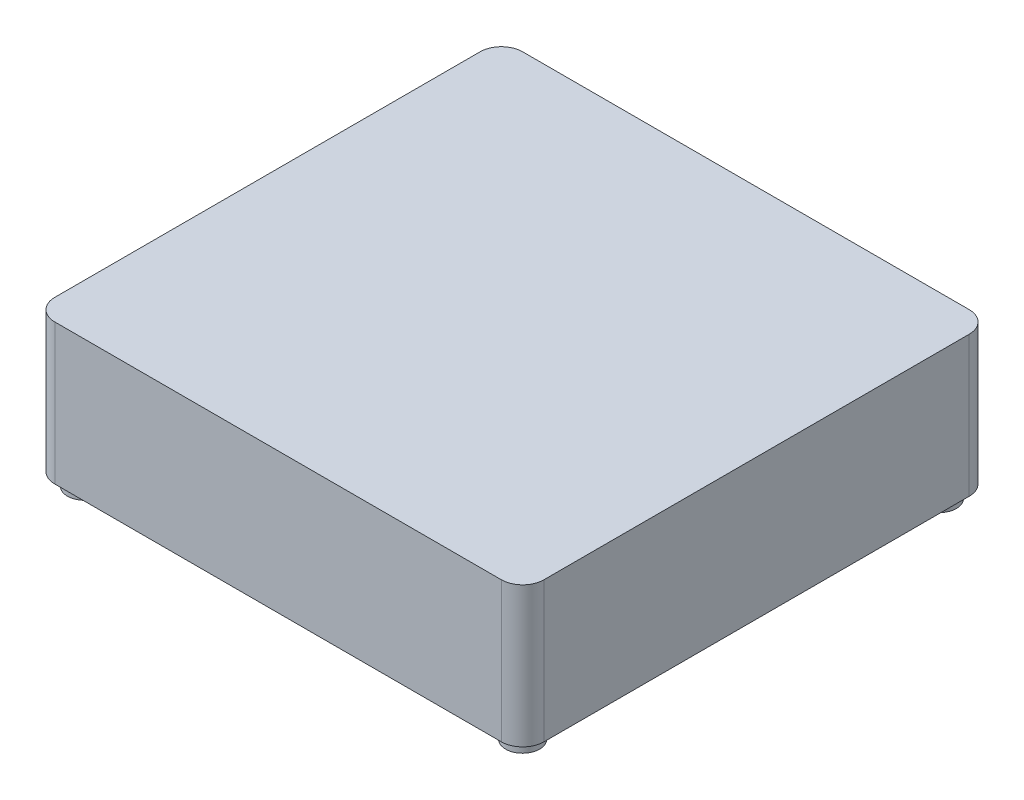
ISO-10303-21;
HEADER;
FILE_DESCRIPTION(('STEP AP214'),'2;1');
FILE_NAME('part.step','',(''),(''),'','','');
FILE_SCHEMA(('AUTOMOTIVE_DESIGN { 1 0 10303 214 1 1 1 1 }'));
ENDSEC;
DATA;
#1=APPLICATION_CONTEXT('core data for automotive mechanical design processes');
#2=APPLICATION_PROTOCOL_DEFINITION('international standard','automotive_design',2000,#1);
#3=PRODUCT_CONTEXT('',#1,'mechanical');
#4=PRODUCT('Part','Part','',(#3));
#5=PRODUCT_RELATED_PRODUCT_CATEGORY('part','',(#4));
#6=PRODUCT_DEFINITION_FORMATION('','',#4);
#7=PRODUCT_DEFINITION_CONTEXT('part definition',#1,'design');
#8=PRODUCT_DEFINITION('design','',#6,#7);
#9=PRODUCT_DEFINITION_SHAPE('','',#8);
#10=(LENGTH_UNIT() NAMED_UNIT(*) SI_UNIT(.MILLI.,.METRE.));
#11=(NAMED_UNIT(*) PLANE_ANGLE_UNIT() SI_UNIT($,.RADIAN.));
#12=(NAMED_UNIT(*) SI_UNIT($,.STERADIAN.) SOLID_ANGLE_UNIT());
#13=UNCERTAINTY_MEASURE_WITH_UNIT(LENGTH_MEASURE(1.E-05),#10,'distance_accuracy_value','');
#14=(GEOMETRIC_REPRESENTATION_CONTEXT(3) GLOBAL_UNCERTAINTY_ASSIGNED_CONTEXT((#13)) GLOBAL_UNIT_ASSIGNED_CONTEXT((#10,
#11,#12)) REPRESENTATION_CONTEXT('',''));
#15=CARTESIAN_POINT('',(0.,0.,0.));
#16=DIRECTION('',(0.,0.,1.));
#17=DIRECTION('',(1.,0.,0.));
#18=AXIS2_PLACEMENT_3D('',#15,#16,#17);
#19=CARTESIAN_POINT('',(-52.5,33.,-50.));
#20=DIRECTION('',(0.,-1.,0.));
#21=DIRECTION('',(0.,0.,-1.));
#22=AXIS2_PLACEMENT_3D('',#19,#20,#21);
#23=CYLINDRICAL_SURFACE('',#22,5.);
#24=CARTESIAN_POINT('',(-52.5,0.,-50.));
#25=DIRECTION('',(0.,1.,0.));
#26=DIRECTION('',(0.,0.,-1.));
#27=AXIS2_PLACEMENT_3D('',#24,#25,#26);
#28=CIRCLE('',#27,5.);
#29=CARTESIAN_POINT('',(-52.5,0.,-55.));
#30=VERTEX_POINT('',#29);
#31=CARTESIAN_POINT('',(-57.5,0.,-50.));
#32=VERTEX_POINT('',#31);
#33=EDGE_CURVE('E279',#30,#32,#28,.T.);
#34=ORIENTED_EDGE('',*,*,#33,.T.);
#35=DIRECTION('',(0.,-1.,0.));
#36=VECTOR('',#35,1.);
#37=CARTESIAN_POINT('',(-57.5,33.,-50.));
#38=LINE('',#37,#36);
#39=CARTESIAN_POINT('',(-57.5,33.,-50.));
#40=VERTEX_POINT('',#39);
#41=EDGE_CURVE('E11',#40,#32,#38,.T.);
#42=ORIENTED_EDGE('',*,*,#41,.F.);
#43=CARTESIAN_POINT('',(-52.5,33.,-50.));
#44=DIRECTION('',(0.,1.,0.));
#45=DIRECTION('',(0.,0.,-1.));
#46=AXIS2_PLACEMENT_3D('',#43,#44,#45);
#47=CIRCLE('',#46,5.);
#48=CARTESIAN_POINT('',(-52.5,33.,-55.));
#49=VERTEX_POINT('',#48);
#50=EDGE_CURVE('E283',#49,#40,#47,.T.);
#51=ORIENTED_EDGE('',*,*,#50,.F.);
#52=DIRECTION('',(0.,-1.,0.));
#53=VECTOR('',#52,1.);
#54=CARTESIAN_POINT('',(-52.5,33.,-55.));
#55=LINE('',#54,#53);
#56=EDGE_CURVE('E309',#49,#30,#55,.T.);
#57=ORIENTED_EDGE('',*,*,#56,.T.);
#58=EDGE_LOOP('',(#34,#42,#51,#57));
#59=FACE_BOUND('',#58,.T.);
#60=ADVANCED_FACE('F38',(#59),#23,.T.);
#61=CARTESIAN_POINT('',(-57.5,33.,-50.));
#62=DIRECTION('',(1.,0.,0.));
#63=DIRECTION('',(0.,0.,-1.));
#64=AXIS2_PLACEMENT_3D('',#61,#62,#63);
#65=PLANE('',#64);
#66=DIRECTION('',(0.,0.,1.));
#67=VECTOR('',#66,1.);
#68=CARTESIAN_POINT('',(-57.5,0.,-50.));
#69=LINE('',#68,#67);
#70=CARTESIAN_POINT('',(-57.5,0.,50.));
#71=VERTEX_POINT('',#70);
#72=EDGE_CURVE('E313',#32,#71,#69,.T.);
#73=ORIENTED_EDGE('',*,*,#72,.T.);
#74=DIRECTION('',(0.,-1.,0.));
#75=VECTOR('',#74,1.);
#76=CARTESIAN_POINT('',(-57.5,33.,50.));
#77=LINE('',#76,#75);
#78=CARTESIAN_POINT('',(-57.5,33.,50.));
#79=VERTEX_POINT('',#78);
#80=EDGE_CURVE('E46',#79,#71,#77,.T.);
#81=ORIENTED_EDGE('',*,*,#80,.F.);
#82=DIRECTION('',(0.,0.,1.));
#83=VECTOR('',#82,1.);
#84=CARTESIAN_POINT('',(-57.5,33.,-50.));
#85=LINE('',#84,#83);
#86=EDGE_CURVE('E287',#40,#79,#85,.T.);
#87=ORIENTED_EDGE('',*,*,#86,.F.);
#88=ORIENTED_EDGE('',*,*,#41,.T.);
#89=EDGE_LOOP('',(#73,#81,#87,#88));
#90=FACE_BOUND('',#89,.T.);
#91=ADVANCED_FACE('F384',(#90),#65,.F.);
#92=CARTESIAN_POINT('',(-52.5,33.,50.));
#93=DIRECTION('',(0.,-1.,0.));
#94=DIRECTION('',(0.,0.,-1.));
#95=AXIS2_PLACEMENT_3D('',#92,#93,#94);
#96=CYLINDRICAL_SURFACE('',#95,4.99999999999999);
#97=CARTESIAN_POINT('',(-52.5,0.,50.));
#98=DIRECTION('',(0.,1.,0.));
#99=DIRECTION('',(0.,0.,1.));
#100=AXIS2_PLACEMENT_3D('',#97,#98,#99);
#101=CIRCLE('',#100,4.99999999999999);
#102=CARTESIAN_POINT('',(-52.5,0.,55.));
#103=VERTEX_POINT('',#102);
#104=EDGE_CURVE('E316',#71,#103,#101,.T.);
#105=ORIENTED_EDGE('',*,*,#104,.T.);
#106=DIRECTION('',(0.,-1.,0.));
#107=VECTOR('',#106,1.);
#108=CARTESIAN_POINT('',(-52.5,33.,55.));
#109=LINE('',#108,#107);
#110=CARTESIAN_POINT('',(-52.5,33.,55.));
#111=VERTEX_POINT('',#110);
#112=EDGE_CURVE('E352',#111,#103,#109,.T.);
#113=ORIENTED_EDGE('',*,*,#112,.F.);
#114=CARTESIAN_POINT('',(-52.5,33.,50.));
#115=DIRECTION('',(0.,1.,0.));
#116=DIRECTION('',(0.,0.,1.));
#117=AXIS2_PLACEMENT_3D('',#114,#115,#116);
#118=CIRCLE('',#117,4.99999999999999);
#119=EDGE_CURVE('E291',#79,#111,#118,.T.);
#120=ORIENTED_EDGE('',*,*,#119,.F.);
#121=ORIENTED_EDGE('',*,*,#80,.T.);
#122=EDGE_LOOP('',(#105,#113,#120,#121));
#123=FACE_BOUND('',#122,.T.);
#124=ADVANCED_FACE('F361',(#123),#96,.T.);
#125=CARTESIAN_POINT('',(-52.5,33.,55.));
#126=DIRECTION('',(0.,0.,-1.));
#127=DIRECTION('',(-1.,0.,0.));
#128=AXIS2_PLACEMENT_3D('',#125,#126,#127);
#129=PLANE('',#128);
#130=DIRECTION('',(1.,0.,0.));
#131=VECTOR('',#130,1.);
#132=CARTESIAN_POINT('',(-52.5,0.,55.));
#133=LINE('',#132,#131);
#134=CARTESIAN_POINT('',(52.5,0.,55.));
#135=VERTEX_POINT('',#134);
#136=EDGE_CURVE('E319',#103,#135,#133,.T.);
#137=ORIENTED_EDGE('',*,*,#136,.T.);
#138=DIRECTION('',(0.,-1.,0.));
#139=VECTOR('',#138,1.);
#140=CARTESIAN_POINT('',(52.5,33.,55.));
#141=LINE('',#140,#139);
#142=CARTESIAN_POINT('',(52.5,33.,55.));
#143=VERTEX_POINT('',#142);
#144=EDGE_CURVE('E348',#143,#135,#141,.T.);
#145=ORIENTED_EDGE('',*,*,#144,.F.);
#146=DIRECTION('',(1.,0.,0.));
#147=VECTOR('',#146,1.);
#148=CARTESIAN_POINT('',(-52.5,33.,55.));
#149=LINE('',#148,#147);
#150=EDGE_CURVE('E294',#111,#143,#149,.T.);
#151=ORIENTED_EDGE('',*,*,#150,.F.);
#152=ORIENTED_EDGE('',*,*,#112,.T.);
#153=EDGE_LOOP('',(#137,#145,#151,#152));
#154=FACE_BOUND('',#153,.T.);
#155=ADVANCED_FACE('F372',(#154),#129,.F.);
#156=CARTESIAN_POINT('',(52.5,33.,50.));
#157=DIRECTION('',(0.,-1.,0.));
#158=DIRECTION('',(0.,0.,-1.));
#159=AXIS2_PLACEMENT_3D('',#156,#157,#158);
#160=CYLINDRICAL_SURFACE('',#159,4.99999999999999);
#161=CARTESIAN_POINT('',(52.5,0.,50.));
#162=DIRECTION('',(0.,1.,0.));
#163=DIRECTION('',(0.,0.,1.));
#164=AXIS2_PLACEMENT_3D('',#161,#162,#163);
#165=CIRCLE('',#164,4.99999999999999);
#166=CARTESIAN_POINT('',(57.5,0.,50.));
#167=VERTEX_POINT('',#166);
#168=EDGE_CURVE('E322',#135,#167,#165,.T.);
#169=ORIENTED_EDGE('',*,*,#168,.T.);
#170=DIRECTION('',(0.,-1.,0.));
#171=VECTOR('',#170,1.);
#172=CARTESIAN_POINT('',(57.5,33.,50.));
#173=LINE('',#172,#171);
#174=CARTESIAN_POINT('',(57.5,33.,50.));
#175=VERTEX_POINT('',#174);
#176=EDGE_CURVE('E344',#175,#167,#173,.T.);
#177=ORIENTED_EDGE('',*,*,#176,.F.);
#178=CARTESIAN_POINT('',(52.5,33.,50.));
#179=DIRECTION('',(0.,1.,0.));
#180=DIRECTION('',(0.,0.,1.));
#181=AXIS2_PLACEMENT_3D('',#178,#179,#180);
#182=CIRCLE('',#181,4.99999999999999);
#183=EDGE_CURVE('E297',#143,#175,#182,.T.);
#184=ORIENTED_EDGE('',*,*,#183,.F.);
#185=ORIENTED_EDGE('',*,*,#144,.T.);
#186=EDGE_LOOP('',(#169,#177,#184,#185));
#187=FACE_BOUND('',#186,.T.);
#188=ADVANCED_FACE('F376',(#187),#160,.T.);
#189=CARTESIAN_POINT('',(57.5,33.,-50.));
#190=DIRECTION('',(-1.,0.,0.));
#191=DIRECTION('',(0.,0.,1.));
#192=AXIS2_PLACEMENT_3D('',#189,#190,#191);
#193=PLANE('',#192);
#194=DIRECTION('',(0.,0.,-1.));
#195=VECTOR('',#194,1.);
#196=CARTESIAN_POINT('',(57.5,0.,-50.));
#197=LINE('',#196,#195);
#198=CARTESIAN_POINT('',(57.5,0.,-50.));
#199=VERTEX_POINT('',#198);
#200=EDGE_CURVE('E325',#167,#199,#197,.T.);
#201=ORIENTED_EDGE('',*,*,#200,.T.);
#202=DIRECTION('',(0.,-1.,0.));
#203=VECTOR('',#202,1.);
#204=CARTESIAN_POINT('',(57.5,33.,-50.));
#205=LINE('',#204,#203);
#206=CARTESIAN_POINT('',(57.5,33.,-50.));
#207=VERTEX_POINT('',#206);
#208=EDGE_CURVE('E340',#207,#199,#205,.T.);
#209=ORIENTED_EDGE('',*,*,#208,.F.);
#210=DIRECTION('',(0.,0.,-1.));
#211=VECTOR('',#210,1.);
#212=CARTESIAN_POINT('',(57.5,33.,-50.));
#213=LINE('',#212,#211);
#214=EDGE_CURVE('E300',#175,#207,#213,.T.);
#215=ORIENTED_EDGE('',*,*,#214,.F.);
#216=ORIENTED_EDGE('',*,*,#176,.T.);
#217=EDGE_LOOP('',(#201,#209,#215,#216));
#218=FACE_BOUND('',#217,.T.);
#219=ADVANCED_FACE('F397',(#218),#193,.F.);
#220=CARTESIAN_POINT('',(52.5,33.,-50.));
#221=DIRECTION('',(0.,-1.,0.));
#222=DIRECTION('',(0.,0.,-1.));
#223=AXIS2_PLACEMENT_3D('',#220,#221,#222);
#224=CYLINDRICAL_SURFACE('',#223,5.);
#225=CARTESIAN_POINT('',(52.5,0.,-50.));
#226=DIRECTION('',(0.,1.,0.));
#227=DIRECTION('',(0.,0.,1.));
#228=AXIS2_PLACEMENT_3D('',#225,#226,#227);
#229=CIRCLE('',#228,5.);
#230=CARTESIAN_POINT('',(52.5,0.,-55.));
#231=VERTEX_POINT('',#230);
#232=EDGE_CURVE('E328',#199,#231,#229,.T.);
#233=ORIENTED_EDGE('',*,*,#232,.T.);
#234=DIRECTION('',(0.,-1.,0.));
#235=VECTOR('',#234,1.);
#236=CARTESIAN_POINT('',(52.5,33.,-55.));
#237=LINE('',#236,#235);
#238=CARTESIAN_POINT('',(52.5,33.,-55.));
#239=VERTEX_POINT('',#238);
#240=EDGE_CURVE('E336',#239,#231,#237,.T.);
#241=ORIENTED_EDGE('',*,*,#240,.F.);
#242=CARTESIAN_POINT('',(52.5,33.,-50.));
#243=DIRECTION('',(0.,1.,0.));
#244=DIRECTION('',(0.,0.,1.));
#245=AXIS2_PLACEMENT_3D('',#242,#243,#244);
#246=CIRCLE('',#245,5.);
#247=EDGE_CURVE('E303',#207,#239,#246,.T.);
#248=ORIENTED_EDGE('',*,*,#247,.F.);
#249=ORIENTED_EDGE('',*,*,#208,.T.);
#250=EDGE_LOOP('',(#233,#241,#248,#249));
#251=FACE_BOUND('',#250,.T.);
#252=ADVANCED_FACE('F395',(#251),#224,.T.);
#253=CARTESIAN_POINT('',(-52.5,33.,-55.));
#254=DIRECTION('',(0.,0.,1.));
#255=DIRECTION('',(1.,0.,0.));
#256=AXIS2_PLACEMENT_3D('',#253,#254,#255);
#257=PLANE('',#256);
#258=DIRECTION('',(1.,0.,0.));
#259=VECTOR('',#258,1.);
#260=CARTESIAN_POINT('',(-29.5,15.,-55.));
#261=LINE('',#260,#259);
#262=CARTESIAN_POINT('',(-39.5,15.,-55.));
#263=VERTEX_POINT('',#262);
#264=CARTESIAN_POINT('',(-29.5,15.,-55.));
#265=VERTEX_POINT('',#264);
#266=EDGE_CURVE('E228',#263,#265,#261,.T.);
#267=ORIENTED_EDGE('',*,*,#266,.F.);
#268=DIRECTION('',(0.,1.,0.));
#269=VECTOR('',#268,1.);
#270=CARTESIAN_POINT('',(-39.5,15.,-55.));
#271=LINE('',#270,#269);
#272=CARTESIAN_POINT('',(-39.5,5.,-55.));
#273=VERTEX_POINT('',#272);
#274=EDGE_CURVE('E53',#273,#263,#271,.T.);
#275=ORIENTED_EDGE('',*,*,#274,.F.);
#276=DIRECTION('',(-1.,0.,0.));
#277=VECTOR('',#276,1.);
#278=CARTESIAN_POINT('',(-29.5,5.,-55.));
#279=LINE('',#278,#277);
#280=CARTESIAN_POINT('',(-29.5,5.,-55.));
#281=VERTEX_POINT('',#280);
#282=EDGE_CURVE('E213',#281,#273,#279,.T.);
#283=ORIENTED_EDGE('',*,*,#282,.F.);
#284=DIRECTION('',(0.,-1.,0.));
#285=VECTOR('',#284,1.);
#286=CARTESIAN_POINT('',(-29.5,15.,-55.));
#287=LINE('',#286,#285);
#288=EDGE_CURVE('E232',#265,#281,#287,.T.);
#289=ORIENTED_EDGE('',*,*,#288,.F.);
#290=EDGE_LOOP('',(#267,#275,#283,#289));
#291=FACE_BOUND('',#290,.T.);
#292=DIRECTION('',(-1.,0.,0.));
#293=VECTOR('',#292,1.);
#294=CARTESIAN_POINT('',(-52.5,0.,-55.));
#295=LINE('',#294,#293);
#296=EDGE_CURVE('E288',#231,#30,#295,.T.);
#297=ORIENTED_EDGE('',*,*,#296,.T.);
#298=ORIENTED_EDGE('',*,*,#56,.F.);
#299=DIRECTION('',(-1.,0.,0.));
#300=VECTOR('',#299,1.);
#301=CARTESIAN_POINT('',(-52.5,33.,-55.));
#302=LINE('',#301,#300);
#303=EDGE_CURVE('E306',#239,#49,#302,.T.);
#304=ORIENTED_EDGE('',*,*,#303,.F.);
#305=ORIENTED_EDGE('',*,*,#240,.T.);
#306=EDGE_LOOP('',(#297,#298,#304,#305));
#307=FACE_BOUND('',#306,.T.);
#308=ADVANCED_FACE('F390',(#291,#307),#257,.F.);
#309=CARTESIAN_POINT('',(-52.5,33.,-50.));
#310=DIRECTION('',(0.,-1.,0.));
#311=DIRECTION('',(0.,0.,-1.));
#312=AXIS2_PLACEMENT_3D('',#309,#310,#311);
#313=PLANE('',#312);
#314=ORIENTED_EDGE('',*,*,#50,.T.);
#315=ORIENTED_EDGE('',*,*,#86,.T.);
#316=ORIENTED_EDGE('',*,*,#119,.T.);
#317=ORIENTED_EDGE('',*,*,#150,.T.);
#318=ORIENTED_EDGE('',*,*,#183,.T.);
#319=ORIENTED_EDGE('',*,*,#214,.T.);
#320=ORIENTED_EDGE('',*,*,#247,.T.);
#321=ORIENTED_EDGE('',*,*,#303,.T.);
#322=EDGE_LOOP('',(#314,#315,#316,#317,#318,#319,#320,#321));
#323=FACE_BOUND('',#322,.T.);
#324=ADVANCED_FACE('F380',(#323),#313,.F.);
#325=CARTESIAN_POINT('',(-52.5,0.,-50.));
#326=DIRECTION('',(0.,-1.,0.));
#327=DIRECTION('',(0.,0.,-1.));
#328=AXIS2_PLACEMENT_3D('',#325,#326,#327);
#329=PLANE('',#328);
#330=CARTESIAN_POINT('',(51.5,0.,-49.));
#331=DIRECTION('',(0.,-1.,0.));
#332=DIRECTION('',(0.,0.,-1.));
#333=AXIS2_PLACEMENT_3D('',#330,#331,#332);
#334=CIRCLE('',#333,4.00000000000001);
#335=CARTESIAN_POINT('',(51.5,0.,-53.));
#336=VERTEX_POINT('',#335);
#337=EDGE_CURVE('E242',#336,#336,#334,.T.);
#338=ORIENTED_EDGE('',*,*,#337,.F.);
#339=EDGE_LOOP('',(#338));
#340=FACE_BOUND('',#339,.T.);
#341=CARTESIAN_POINT('',(-51.5,0.,-49.));
#342=DIRECTION('',(0.,-1.,0.));
#343=DIRECTION('',(0.,0.,-1.));
#344=AXIS2_PLACEMENT_3D('',#341,#342,#343);
#345=CIRCLE('',#344,4.00000000000001);
#346=CARTESIAN_POINT('',(-51.5,0.,-53.));
#347=VERTEX_POINT('',#346);
#348=EDGE_CURVE('E255',#347,#347,#345,.T.);
#349=ORIENTED_EDGE('',*,*,#348,.F.);
#350=EDGE_LOOP('',(#349));
#351=FACE_BOUND('',#350,.T.);
#352=CARTESIAN_POINT('',(51.5,0.,49.));
#353=DIRECTION('',(0.,-1.,0.));
#354=DIRECTION('',(0.,0.,-1.));
#355=AXIS2_PLACEMENT_3D('',#352,#353,#354);
#356=CIRCLE('',#355,4.00000000000001);
#357=CARTESIAN_POINT('',(51.5,0.,45.));
#358=VERTEX_POINT('',#357);
#359=EDGE_CURVE('E263',#358,#358,#356,.T.);
#360=ORIENTED_EDGE('',*,*,#359,.F.);
#361=EDGE_LOOP('',(#360));
#362=FACE_BOUND('',#361,.T.);
#363=CARTESIAN_POINT('',(-51.5,0.,49.));
#364=DIRECTION('',(0.,-1.,0.));
#365=DIRECTION('',(0.,0.,-1.));
#366=AXIS2_PLACEMENT_3D('',#363,#364,#365);
#367=CIRCLE('',#366,4.00000000000001);
#368=CARTESIAN_POINT('',(-51.5,0.,45.));
#369=VERTEX_POINT('',#368);
#370=EDGE_CURVE('E271',#369,#369,#367,.T.);
#371=ORIENTED_EDGE('',*,*,#370,.F.);
#372=EDGE_LOOP('',(#371));
#373=FACE_BOUND('',#372,.T.);
#374=ORIENTED_EDGE('',*,*,#33,.F.);
#375=ORIENTED_EDGE('',*,*,#296,.F.);
#376=ORIENTED_EDGE('',*,*,#232,.F.);
#377=ORIENTED_EDGE('',*,*,#200,.F.);
#378=ORIENTED_EDGE('',*,*,#168,.F.);
#379=ORIENTED_EDGE('',*,*,#136,.F.);
#380=ORIENTED_EDGE('',*,*,#104,.F.);
#381=ORIENTED_EDGE('',*,*,#72,.F.);
#382=EDGE_LOOP('',(#374,#375,#376,#377,#378,#379,#380,#381));
#383=FACE_BOUND('',#382,.T.);
#384=ADVANCED_FACE('F367',(#340,#351,#362,#373,#383),#329,.T.);
#385=CARTESIAN_POINT('',(-51.5,-3.,49.));
#386=DIRECTION('',(0.,1.,0.));
#387=DIRECTION('',(0.,0.,1.));
#388=AXIS2_PLACEMENT_3D('',#385,#386,#387);
#389=CYLINDRICAL_SURFACE('',#388,4.00000000000001);
#390=CARTESIAN_POINT('',(-51.5,-3.,49.));
#391=DIRECTION('',(0.,-1.,0.));
#392=DIRECTION('',(0.,0.,-1.));
#393=AXIS2_PLACEMENT_3D('',#390,#391,#392);
#394=CIRCLE('',#393,4.00000000000001);
#395=CARTESIAN_POINT('',(-51.5,-3.,45.));
#396=VERTEX_POINT('',#395);
#397=EDGE_CURVE('E275',#396,#396,#394,.T.);
#398=ORIENTED_EDGE('',*,*,#397,.F.);
#399=EDGE_LOOP('',(#398));
#400=FACE_BOUND('',#399,.T.);
#401=ORIENTED_EDGE('',*,*,#370,.T.);
#402=EDGE_LOOP('',(#401));
#403=FACE_BOUND('',#402,.T.);
#404=ADVANCED_FACE('F453',(#400,#403),#389,.T.);
#405=CARTESIAN_POINT('',(-51.5,-3.,49.));
#406=DIRECTION('',(0.,-1.,0.));
#407=DIRECTION('',(0.,0.,-1.));
#408=AXIS2_PLACEMENT_3D('',#405,#406,#407);
#409=PLANE('',#408);
#410=ORIENTED_EDGE('',*,*,#397,.T.);
#411=EDGE_LOOP('',(#410));
#412=FACE_BOUND('',#411,.T.);
#413=ADVANCED_FACE('F463',(#412),#409,.T.);
#414=CARTESIAN_POINT('',(51.5,-3.,49.));
#415=DIRECTION('',(0.,1.,0.));
#416=DIRECTION('',(0.,0.,1.));
#417=AXIS2_PLACEMENT_3D('',#414,#415,#416);
#418=CYLINDRICAL_SURFACE('',#417,4.00000000000001);
#419=CARTESIAN_POINT('',(51.5,-3.,49.));
#420=DIRECTION('',(0.,-1.,0.));
#421=DIRECTION('',(0.,0.,-1.));
#422=AXIS2_PLACEMENT_3D('',#419,#420,#421);
#423=CIRCLE('',#422,4.00000000000001);
#424=CARTESIAN_POINT('',(51.5,-3.,45.));
#425=VERTEX_POINT('',#424);
#426=EDGE_CURVE('E267',#425,#425,#423,.T.);
#427=ORIENTED_EDGE('',*,*,#426,.F.);
#428=EDGE_LOOP('',(#427));
#429=FACE_BOUND('',#428,.T.);
#430=ORIENTED_EDGE('',*,*,#359,.T.);
#431=EDGE_LOOP('',(#430));
#432=FACE_BOUND('',#431,.T.);
#433=ADVANCED_FACE('F473',(#429,#432),#418,.T.);
#434=CARTESIAN_POINT('',(51.5,-3.,49.));
#435=DIRECTION('',(0.,-1.,0.));
#436=DIRECTION('',(0.,0.,-1.));
#437=AXIS2_PLACEMENT_3D('',#434,#435,#436);
#438=PLANE('',#437);
#439=ORIENTED_EDGE('',*,*,#426,.T.);
#440=EDGE_LOOP('',(#439));
#441=FACE_BOUND('',#440,.T.);
#442=ADVANCED_FACE('F483',(#441),#438,.T.);
#443=CARTESIAN_POINT('',(-51.5,-3.,-49.));
#444=DIRECTION('',(0.,1.,0.));
#445=DIRECTION('',(0.,0.,1.));
#446=AXIS2_PLACEMENT_3D('',#443,#444,#445);
#447=CYLINDRICAL_SURFACE('',#446,4.00000000000001);
#448=CARTESIAN_POINT('',(-51.5,-3.,-49.));
#449=DIRECTION('',(0.,-1.,0.));
#450=DIRECTION('',(0.,0.,-1.));
#451=AXIS2_PLACEMENT_3D('',#448,#449,#450);
#452=CIRCLE('',#451,4.00000000000001);
#453=CARTESIAN_POINT('',(-51.5,-3.,-53.));
#454=VERTEX_POINT('',#453);
#455=EDGE_CURVE('E259',#454,#454,#452,.T.);
#456=ORIENTED_EDGE('',*,*,#455,.F.);
#457=EDGE_LOOP('',(#456));
#458=FACE_BOUND('',#457,.T.);
#459=ORIENTED_EDGE('',*,*,#348,.T.);
#460=EDGE_LOOP('',(#459));
#461=FACE_BOUND('',#460,.T.);
#462=ADVANCED_FACE('F493',(#458,#461),#447,.T.);
#463=CARTESIAN_POINT('',(-51.5,-3.,-49.));
#464=DIRECTION('',(0.,-1.,0.));
#465=DIRECTION('',(0.,0.,-1.));
#466=AXIS2_PLACEMENT_3D('',#463,#464,#465);
#467=PLANE('',#466);
#468=ORIENTED_EDGE('',*,*,#455,.T.);
#469=EDGE_LOOP('',(#468));
#470=FACE_BOUND('',#469,.T.);
#471=ADVANCED_FACE('F503',(#470),#467,.T.);
#472=CARTESIAN_POINT('',(51.5,-3.,-49.));
#473=DIRECTION('',(0.,1.,0.));
#474=DIRECTION('',(0.,0.,1.));
#475=AXIS2_PLACEMENT_3D('',#472,#473,#474);
#476=CYLINDRICAL_SURFACE('',#475,4.00000000000001);
#477=CARTESIAN_POINT('',(51.5,-3.,-49.));
#478=DIRECTION('',(0.,-1.,0.));
#479=DIRECTION('',(0.,0.,-1.));
#480=AXIS2_PLACEMENT_3D('',#477,#478,#479);
#481=CIRCLE('',#480,4.00000000000001);
#482=CARTESIAN_POINT('',(51.5,-3.,-53.));
#483=VERTEX_POINT('',#482);
#484=EDGE_CURVE('E251',#483,#483,#481,.T.);
#485=ORIENTED_EDGE('',*,*,#484,.F.);
#486=EDGE_LOOP('',(#485));
#487=FACE_BOUND('',#486,.T.);
#488=ORIENTED_EDGE('',*,*,#337,.T.);
#489=EDGE_LOOP('',(#488));
#490=FACE_BOUND('',#489,.T.);
#491=ADVANCED_FACE('F513',(#487,#490),#476,.T.);
#492=CARTESIAN_POINT('',(51.5,-3.,-49.));
#493=DIRECTION('',(0.,-1.,0.));
#494=DIRECTION('',(0.,0.,-1.));
#495=AXIS2_PLACEMENT_3D('',#492,#493,#494);
#496=PLANE('',#495);
#497=ORIENTED_EDGE('',*,*,#484,.T.);
#498=EDGE_LOOP('',(#497));
#499=FACE_BOUND('',#498,.T.);
#500=ADVANCED_FACE('F523',(#499),#496,.T.);
#501=CARTESIAN_POINT('',(-39.5,15.,-50.));
#502=DIRECTION('',(-1.,0.,0.));
#503=DIRECTION('',(0.,0.,1.));
#504=AXIS2_PLACEMENT_3D('',#501,#502,#503);
#505=PLANE('',#504);
#506=ORIENTED_EDGE('',*,*,#274,.T.);
#507=DIRECTION('',(0.,0.,-1.));
#508=VECTOR('',#507,1.);
#509=CARTESIAN_POINT('',(-39.5,15.,-50.));
#510=LINE('',#509,#508);
#511=CARTESIAN_POINT('',(-39.5,15.,-50.));
#512=VERTEX_POINT('',#511);
#513=EDGE_CURVE('E225',#512,#263,#510,.T.);
#514=ORIENTED_EDGE('',*,*,#513,.F.);
#515=DIRECTION('',(0.,1.,0.));
#516=VECTOR('',#515,1.);
#517=CARTESIAN_POINT('',(-39.5,15.,-50.));
#518=LINE('',#517,#516);
#519=CARTESIAN_POINT('',(-39.5,5.,-50.));
#520=VERTEX_POINT('',#519);
#521=EDGE_CURVE('E208',#520,#512,#518,.T.);
#522=ORIENTED_EDGE('',*,*,#521,.F.);
#523=DIRECTION('',(0.,0.,-1.));
#524=VECTOR('',#523,1.);
#525=CARTESIAN_POINT('',(-39.5,5.,-50.));
#526=LINE('',#525,#524);
#527=EDGE_CURVE('E239',#520,#273,#526,.T.);
#528=ORIENTED_EDGE('',*,*,#527,.T.);
#529=EDGE_LOOP('',(#506,#514,#522,#528));
#530=FACE_BOUND('',#529,.T.);
#531=ADVANCED_FACE('F533',(#530),#505,.F.);
#532=CARTESIAN_POINT('',(-29.5,5.,-50.));
#533=DIRECTION('',(0.,-1.,0.));
#534=DIRECTION('',(1.,0.,0.));
#535=AXIS2_PLACEMENT_3D('',#532,#533,#534);
#536=PLANE('',#535);
#537=ORIENTED_EDGE('',*,*,#282,.T.);
#538=ORIENTED_EDGE('',*,*,#527,.F.);
#539=DIRECTION('',(-1.,0.,0.));
#540=VECTOR('',#539,1.);
#541=CARTESIAN_POINT('',(-29.5,5.,-50.));
#542=LINE('',#541,#540);
#543=CARTESIAN_POINT('',(-29.5,5.,-50.));
#544=VERTEX_POINT('',#543);
#545=EDGE_CURVE('E221',#544,#520,#542,.T.);
#546=ORIENTED_EDGE('',*,*,#545,.F.);
#547=DIRECTION('',(0.,0.,-1.));
#548=VECTOR('',#547,1.);
#549=CARTESIAN_POINT('',(-29.5,5.,-50.));
#550=LINE('',#549,#548);
#551=EDGE_CURVE('E243',#544,#281,#550,.T.);
#552=ORIENTED_EDGE('',*,*,#551,.T.);
#553=EDGE_LOOP('',(#537,#538,#546,#552));
#554=FACE_BOUND('',#553,.T.);
#555=ADVANCED_FACE('F552',(#554),#536,.F.);
#556=CARTESIAN_POINT('',(-29.5,15.,-50.));
#557=DIRECTION('',(1.,0.,0.));
#558=DIRECTION('',(0.,0.,-1.));
#559=AXIS2_PLACEMENT_3D('',#556,#557,#558);
#560=PLANE('',#559);
#561=ORIENTED_EDGE('',*,*,#288,.T.);
#562=ORIENTED_EDGE('',*,*,#551,.F.);
#563=DIRECTION('',(0.,-1.,0.));
#564=VECTOR('',#563,1.);
#565=CARTESIAN_POINT('',(-29.5,15.,-50.));
#566=LINE('',#565,#564);
#567=CARTESIAN_POINT('',(-29.5,15.,-50.));
#568=VERTEX_POINT('',#567);
#569=EDGE_CURVE('E217',#568,#544,#566,.T.);
#570=ORIENTED_EDGE('',*,*,#569,.F.);
#571=DIRECTION('',(0.,0.,-1.));
#572=VECTOR('',#571,1.);
#573=CARTESIAN_POINT('',(-29.5,15.,-50.));
#574=LINE('',#573,#572);
#575=EDGE_CURVE('E246',#568,#265,#574,.T.);
#576=ORIENTED_EDGE('',*,*,#575,.T.);
#577=EDGE_LOOP('',(#561,#562,#570,#576));
#578=FACE_BOUND('',#577,.T.);
#579=ADVANCED_FACE('F562',(#578),#560,.F.);
#580=CARTESIAN_POINT('',(-29.5,15.,-50.));
#581=DIRECTION('',(0.,1.,0.));
#582=DIRECTION('',(0.,0.,1.));
#583=AXIS2_PLACEMENT_3D('',#580,#581,#582);
#584=PLANE('',#583);
#585=ORIENTED_EDGE('',*,*,#266,.T.);
#586=ORIENTED_EDGE('',*,*,#575,.F.);
#587=DIRECTION('',(1.,0.,0.));
#588=VECTOR('',#587,1.);
#589=CARTESIAN_POINT('',(-29.5,15.,-50.));
#590=LINE('',#589,#588);
#591=EDGE_CURVE('E212',#512,#568,#590,.T.);
#592=ORIENTED_EDGE('',*,*,#591,.F.);
#593=ORIENTED_EDGE('',*,*,#513,.T.);
#594=EDGE_LOOP('',(#585,#586,#592,#593));
#595=FACE_BOUND('',#594,.T.);
#596=ADVANCED_FACE('F572',(#595),#584,.F.);
#597=CARTESIAN_POINT('',(0.,0.,-50.));
#598=DIRECTION('',(0.,0.,-1.));
#599=DIRECTION('',(-1.,0.,0.));
#600=AXIS2_PLACEMENT_3D('',#597,#598,#599);
#601=PLANE('',#600);
#602=DIRECTION('',(-1.,0.,0.));
#603=VECTOR('',#602,1.);
#604=CARTESIAN_POINT('',(-30.,5.5,-50.));
#605=LINE('',#604,#603);
#606=CARTESIAN_POINT('',(-30.,5.5,-50.));
#607=VERTEX_POINT('',#606);
#608=CARTESIAN_POINT('',(-39.,5.5,-50.));
#609=VERTEX_POINT('',#608);
#610=EDGE_CURVE('E164',#607,#609,#605,.T.);
#611=ORIENTED_EDGE('',*,*,#610,.F.);
#612=DIRECTION('',(0.,-1.,0.));
#613=VECTOR('',#612,1.);
#614=CARTESIAN_POINT('',(-30.,14.5,-50.));
#615=LINE('',#614,#613);
#616=CARTESIAN_POINT('',(-30.,14.5,-50.));
#617=VERTEX_POINT('',#616);
#618=EDGE_CURVE('E174',#617,#607,#615,.T.);
#619=ORIENTED_EDGE('',*,*,#618,.F.);
#620=DIRECTION('',(1.,0.,0.));
#621=VECTOR('',#620,1.);
#622=CARTESIAN_POINT('',(-30.,14.5,-50.));
#623=LINE('',#622,#621);
#624=CARTESIAN_POINT('',(-39.,14.5,-50.));
#625=VERTEX_POINT('',#624);
#626=EDGE_CURVE('E155',#625,#617,#623,.T.);
#627=ORIENTED_EDGE('',*,*,#626,.F.);
#628=DIRECTION('',(0.,1.,0.));
#629=VECTOR('',#628,1.);
#630=CARTESIAN_POINT('',(-39.,14.5,-50.));
#631=LINE('',#630,#629);
#632=EDGE_CURVE('E171',#609,#625,#631,.T.);
#633=ORIENTED_EDGE('',*,*,#632,.F.);
#634=EDGE_LOOP('',(#611,#619,#627,#633));
#635=FACE_BOUND('',#634,.T.);
#636=ORIENTED_EDGE('',*,*,#521,.T.);
#637=ORIENTED_EDGE('',*,*,#591,.T.);
#638=ORIENTED_EDGE('',*,*,#569,.T.);
#639=ORIENTED_EDGE('',*,*,#545,.T.);
#640=EDGE_LOOP('',(#636,#637,#638,#639));
#641=FACE_BOUND('',#640,.T.);
#642=ADVANCED_FACE('F169',(#635,#641),#601,.T.);
#643=CARTESIAN_POINT('',(-39.,14.5,-50.));
#644=DIRECTION('',(-1.,0.,0.));
#645=DIRECTION('',(0.,0.,1.));
#646=AXIS2_PLACEMENT_3D('',#643,#644,#645);
#647=PLANE('',#646);
#648=DIRECTION('',(0.,1.,0.));
#649=VECTOR('',#648,1.);
#650=CARTESIAN_POINT('',(-39.,14.5,-55.));
#651=LINE('',#650,#649);
#652=CARTESIAN_POINT('',(-39.,5.5,-55.));
#653=VERTEX_POINT('',#652);
#654=CARTESIAN_POINT('',(-39.,14.5,-55.));
#655=VERTEX_POINT('',#654);
#656=EDGE_CURVE('E193',#653,#655,#651,.T.);
#657=ORIENTED_EDGE('',*,*,#656,.F.);
#658=DIRECTION('',(0.,0.,-1.));
#659=VECTOR('',#658,1.);
#660=CARTESIAN_POINT('',(-39.,5.5,-50.));
#661=LINE('',#660,#659);
#662=EDGE_CURVE('E178',#609,#653,#661,.T.);
#663=ORIENTED_EDGE('',*,*,#662,.F.);
#664=ORIENTED_EDGE('',*,*,#632,.T.);
#665=DIRECTION('',(0.,0.,-1.));
#666=VECTOR('',#665,1.);
#667=CARTESIAN_POINT('',(-39.,14.5,-50.));
#668=LINE('',#667,#666);
#669=EDGE_CURVE('E152',#625,#655,#668,.T.);
#670=ORIENTED_EDGE('',*,*,#669,.T.);
#671=EDGE_LOOP('',(#657,#663,#664,#670));
#672=FACE_BOUND('',#671,.T.);
#673=ADVANCED_FACE('F177',(#672),#647,.T.);
#674=CARTESIAN_POINT('',(-30.,5.5,-50.));
#675=DIRECTION('',(0.,-1.,0.));
#676=DIRECTION('',(0.,0.,-1.));
#677=AXIS2_PLACEMENT_3D('',#674,#675,#676);
#678=PLANE('',#677);
#679=DIRECTION('',(-1.,0.,0.));
#680=VECTOR('',#679,1.);
#681=CARTESIAN_POINT('',(-30.,5.5,-55.));
#682=LINE('',#681,#680);
#683=CARTESIAN_POINT('',(-30.,5.5,-55.));
#684=VERTEX_POINT('',#683);
#685=EDGE_CURVE('E180',#684,#653,#682,.T.);
#686=ORIENTED_EDGE('',*,*,#685,.F.);
#687=DIRECTION('',(0.,0.,-1.));
#688=VECTOR('',#687,1.);
#689=CARTESIAN_POINT('',(-30.,5.5,-50.));
#690=LINE('',#689,#688);
#691=EDGE_CURVE('E203',#607,#684,#690,.T.);
#692=ORIENTED_EDGE('',*,*,#691,.F.);
#693=ORIENTED_EDGE('',*,*,#610,.T.);
#694=ORIENTED_EDGE('',*,*,#662,.T.);
#695=EDGE_LOOP('',(#686,#692,#693,#694));
#696=FACE_BOUND('',#695,.T.);
#697=ADVANCED_FACE('F599',(#696),#678,.T.);
#698=CARTESIAN_POINT('',(-30.,14.5,-50.));
#699=DIRECTION('',(1.,0.,0.));
#700=DIRECTION('',(0.,0.,-1.));
#701=AXIS2_PLACEMENT_3D('',#698,#699,#700);
#702=PLANE('',#701);
#703=DIRECTION('',(0.,-1.,0.));
#704=VECTOR('',#703,1.);
#705=CARTESIAN_POINT('',(-30.,14.5,-55.));
#706=LINE('',#705,#704);
#707=CARTESIAN_POINT('',(-30.,14.5,-55.));
#708=VERTEX_POINT('',#707);
#709=EDGE_CURVE('E61',#708,#684,#706,.T.);
#710=ORIENTED_EDGE('',*,*,#709,.F.);
#711=DIRECTION('',(0.,0.,-1.));
#712=VECTOR('',#711,1.);
#713=CARTESIAN_POINT('',(-30.,14.5,-50.));
#714=LINE('',#713,#712);
#715=EDGE_CURVE('E163',#617,#708,#714,.T.);
#716=ORIENTED_EDGE('',*,*,#715,.F.);
#717=ORIENTED_EDGE('',*,*,#618,.T.);
#718=ORIENTED_EDGE('',*,*,#691,.T.);
#719=EDGE_LOOP('',(#710,#716,#717,#718));
#720=FACE_BOUND('',#719,.T.);
#721=ADVANCED_FACE('F608',(#720),#702,.T.);
#722=CARTESIAN_POINT('',(-30.,14.5,-50.));
#723=DIRECTION('',(0.,1.,0.));
#724=DIRECTION('',(0.,0.,1.));
#725=AXIS2_PLACEMENT_3D('',#722,#723,#724);
#726=PLANE('',#725);
#727=DIRECTION('',(1.,0.,0.));
#728=VECTOR('',#727,1.);
#729=CARTESIAN_POINT('',(-30.,14.5,-55.));
#730=LINE('',#729,#728);
#731=EDGE_CURVE('E157',#655,#708,#730,.T.);
#732=ORIENTED_EDGE('',*,*,#731,.F.);
#733=ORIENTED_EDGE('',*,*,#669,.F.);
#734=ORIENTED_EDGE('',*,*,#626,.T.);
#735=ORIENTED_EDGE('',*,*,#715,.T.);
#736=EDGE_LOOP('',(#732,#733,#734,#735));
#737=FACE_BOUND('',#736,.T.);
#738=ADVANCED_FACE('F154',(#737),#726,.T.);
#739=CARTESIAN_POINT('',(-34.5,10.,-55.));
#740=DIRECTION('',(0.,0.,-1.));
#741=DIRECTION('',(-1.,0.,0.));
#742=AXIS2_PLACEMENT_3D('',#739,#740,#741);
#743=CIRCLE('',#742,3.1);
#744=CARTESIAN_POINT('',(-37.6,10.,-55.));
#745=VERTEX_POINT('',#744);
#746=EDGE_CURVE('E186',#745,#745,#743,.T.);
#747=ORIENTED_EDGE('',*,*,#746,.F.);
#748=EDGE_LOOP('',(#747));
#749=FACE_BOUND('',#748,.T.);
#750=ORIENTED_EDGE('',*,*,#656,.T.);
#751=ORIENTED_EDGE('',*,*,#731,.T.);
#752=ORIENTED_EDGE('',*,*,#709,.T.);
#753=ORIENTED_EDGE('',*,*,#685,.T.);
#754=EDGE_LOOP('',(#750,#751,#752,#753));
#755=FACE_BOUND('',#754,.T.);
#756=ADVANCED_FACE('F546',(#749,#755),#257,.F.);
#757=CARTESIAN_POINT('',(-34.5,10.,-45.));
#758=DIRECTION('',(0.,0.,-1.));
#759=DIRECTION('',(-1.,0.,0.));
#760=AXIS2_PLACEMENT_3D('',#757,#758,#759);
#761=CYLINDRICAL_SURFACE('',#760,3.1);
#762=CARTESIAN_POINT('',(-34.5,10.,-45.));
#763=DIRECTION('',(0.,0.,-1.));
#764=DIRECTION('',(-1.,0.,0.));
#765=AXIS2_PLACEMENT_3D('',#762,#763,#764);
#766=CIRCLE('',#765,3.1);
#767=CARTESIAN_POINT('',(-37.6,10.,-45.));
#768=VERTEX_POINT('',#767);
#769=EDGE_CURVE('E196',#768,#768,#766,.T.);
#770=ORIENTED_EDGE('',*,*,#769,.F.);
#771=EDGE_LOOP('',(#770));
#772=FACE_BOUND('',#771,.T.);
#773=ORIENTED_EDGE('',*,*,#746,.T.);
#774=EDGE_LOOP('',(#773));
#775=FACE_BOUND('',#774,.T.);
#776=ADVANCED_FACE('F634',(#772,#775),#761,.F.);
#777=CARTESIAN_POINT('',(-34.5,10.,-45.));
#778=DIRECTION('',(0.,0.,-1.));
#779=DIRECTION('',(-1.,0.,0.));
#780=AXIS2_PLACEMENT_3D('',#777,#778,#779);
#781=PLANE('',#780);
#782=CARTESIAN_POINT('',(-34.5,10.,-45.));
#783=DIRECTION('',(0.,0.,-1.));
#784=DIRECTION('',(-1.,0.,0.));
#785=AXIS2_PLACEMENT_3D('',#782,#783,#784);
#786=CIRCLE('',#785,3.);
#787=CARTESIAN_POINT('',(-37.5,10.,-45.));
#788=VERTEX_POINT('',#787);
#789=EDGE_CURVE('E677',#788,#788,#786,.T.);
#790=ORIENTED_EDGE('',*,*,#789,.F.);
#791=EDGE_LOOP('',(#790));
#792=FACE_BOUND('',#791,.T.);
#793=ORIENTED_EDGE('',*,*,#769,.T.);
#794=EDGE_LOOP('',(#793));
#795=FACE_BOUND('',#794,.T.);
#796=ADVANCED_FACE('F641',(#792,#795),#781,.T.);
#797=CARTESIAN_POINT('',(-34.5,10.,-45.));
#798=DIRECTION('',(0.,0.,-1.));
#799=DIRECTION('',(-1.,0.,0.));
#800=AXIS2_PLACEMENT_3D('',#797,#798,#799);
#801=CYLINDRICAL_SURFACE('',#800,3.);
#802=ORIENTED_EDGE('',*,*,#789,.T.);
#803=EDGE_LOOP('',(#802));
#804=FACE_BOUND('',#803,.T.);
#805=CARTESIAN_POINT('',(-34.5,10.,-55.));
#806=DIRECTION('',(0.,0.,-1.));
#807=DIRECTION('',(-1.,0.,0.));
#808=AXIS2_PLACEMENT_3D('',#805,#806,#807);
#809=CIRCLE('',#808,3.);
#810=CARTESIAN_POINT('',(-37.5,10.,-55.));
#811=VERTEX_POINT('',#810);
#812=EDGE_CURVE('E674',#811,#811,#809,.T.);
#813=ORIENTED_EDGE('',*,*,#812,.F.);
#814=EDGE_LOOP('',(#813));
#815=FACE_BOUND('',#814,.T.);
#816=ADVANCED_FACE('F651',(#804,#815),#801,.T.);
#817=ORIENTED_EDGE('',*,*,#812,.T.);
#818=EDGE_LOOP('',(#817));
#819=FACE_BOUND('',#818,.T.);
#820=ADVANCED_FACE('F545',(#819),#257,.F.);
#821=CLOSED_SHELL('',(#60,#91,#124,#155,#188,#219,#252,#308,#324,#384,#404,#413,#433,#442,#462,
#471,#491,#500,#531,#555,#579,#596,#642,#673,#697,#721,#738,#756,#776,#796,#816,#820));
#822=MANIFOLD_SOLID_BREP('B2',#821);
#823=ADVANCED_BREP_SHAPE_REPRESENTATION('',(#18,#822),#14);
#824=SHAPE_DEFINITION_REPRESENTATION(#9,#823);
ENDSEC;
END-ISO-10303-21;
